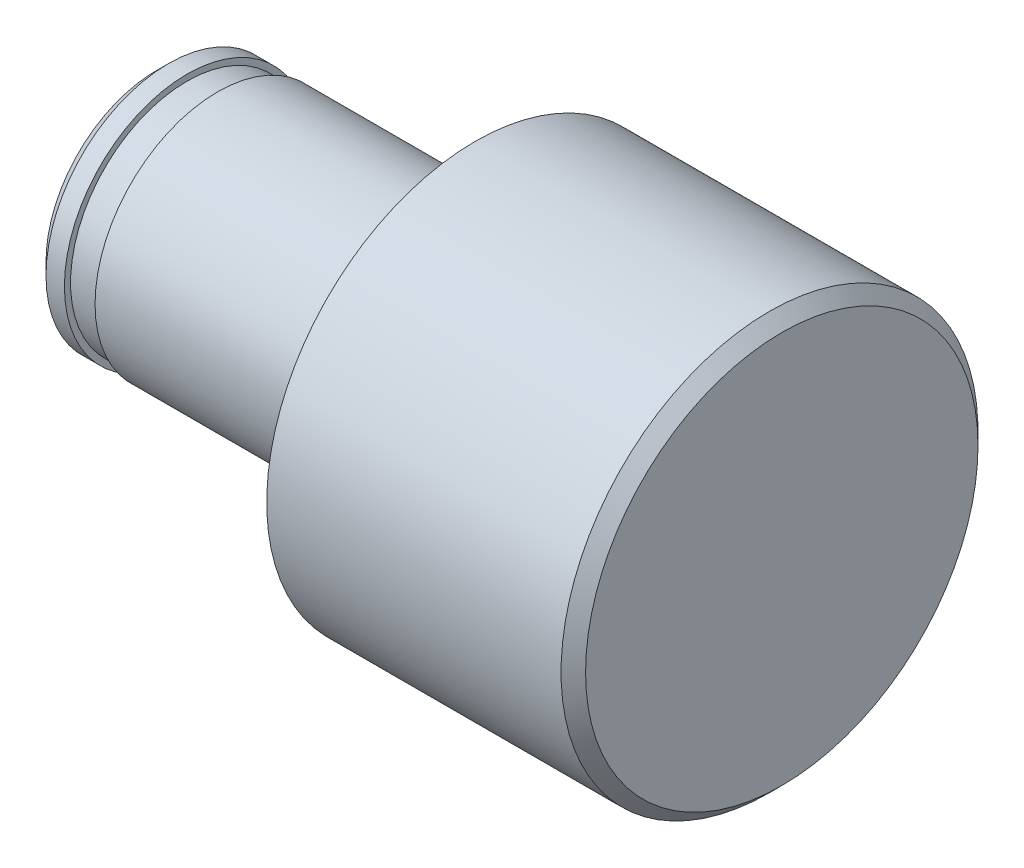
ISO-10303-21;
HEADER;
FILE_DESCRIPTION(('STEP AP214'),'2;1');
FILE_NAME('part.step','',(''),(''),'','','');
FILE_SCHEMA(('AUTOMOTIVE_DESIGN { 1 0 10303 214 1 1 1 1 }'));
ENDSEC;
DATA;
#1=APPLICATION_CONTEXT('core data for automotive mechanical design processes');
#2=APPLICATION_PROTOCOL_DEFINITION('international standard','automotive_design',2000,#1);
#3=PRODUCT_CONTEXT('',#1,'mechanical');
#4=PRODUCT('Part','Part','',(#3));
#5=PRODUCT_RELATED_PRODUCT_CATEGORY('part','',(#4));
#6=PRODUCT_DEFINITION_FORMATION('','',#4);
#7=PRODUCT_DEFINITION_CONTEXT('part definition',#1,'design');
#8=PRODUCT_DEFINITION('design','',#6,#7);
#9=PRODUCT_DEFINITION_SHAPE('','',#8);
#10=(LENGTH_UNIT() NAMED_UNIT(*) SI_UNIT(.MILLI.,.METRE.));
#11=(NAMED_UNIT(*) PLANE_ANGLE_UNIT() SI_UNIT($,.RADIAN.));
#12=(NAMED_UNIT(*) SI_UNIT($,.STERADIAN.) SOLID_ANGLE_UNIT());
#13=UNCERTAINTY_MEASURE_WITH_UNIT(LENGTH_MEASURE(1.E-05),#10,'distance_accuracy_value','');
#14=(GEOMETRIC_REPRESENTATION_CONTEXT(3) GLOBAL_UNCERTAINTY_ASSIGNED_CONTEXT((#13)) GLOBAL_UNIT_ASSIGNED_CONTEXT((#10,
#11,#12)) REPRESENTATION_CONTEXT('',''));
#15=CARTESIAN_POINT('',(0.,0.,0.));
#16=DIRECTION('',(0.,0.,1.));
#17=DIRECTION('',(1.,0.,0.));
#18=AXIS2_PLACEMENT_3D('',#15,#16,#17);
#19=CARTESIAN_POINT('',(3.95645161290323,3.4,0.));
#20=DIRECTION('',(1.,0.,0.));
#21=DIRECTION('',(0.,1.,0.));
#22=AXIS2_PLACEMENT_3D('',#19,#20,#21);
#23=PLANE('',#22);
#24=CARTESIAN_POINT('',(3.95645161290323,0.,0.));
#25=DIRECTION('',(1.,0.,0.));
#26=DIRECTION('',(0.,1.,0.));
#27=AXIS2_PLACEMENT_3D('',#24,#25,#26);
#28=CIRCLE('',#27,3.2);
#29=CARTESIAN_POINT('',(3.95645161290323,3.2,0.));
#30=VERTEX_POINT('',#29);
#31=EDGE_CURVE('E57',#30,#30,#28,.T.);
#32=ORIENTED_EDGE('',*,*,#31,.T.);
#33=EDGE_LOOP('',(#32));
#34=FACE_BOUND('',#33,.T.);
#35=ADVANCED_FACE('F41',(#34),#23,.T.);
#36=CARTESIAN_POINT('',(-6.24354838709677,0.,0.));
#37=DIRECTION('',(-1.,0.,0.));
#38=DIRECTION('',(0.,-1.,0.));
#39=AXIS2_PLACEMENT_3D('',#36,#37,#38);
#40=PLANE('',#39);
#41=CARTESIAN_POINT('',(-6.24354838709677,0.,0.));
#42=DIRECTION('',(-1.,0.,0.));
#43=DIRECTION('',(0.,-1.,0.));
#44=AXIS2_PLACEMENT_3D('',#41,#42,#43);
#45=CIRCLE('',#44,1.8);
#46=CARTESIAN_POINT('',(-6.24354838709677,-1.8,0.));
#47=VERTEX_POINT('',#46);
#48=EDGE_CURVE('E10',#47,#47,#45,.T.);
#49=ORIENTED_EDGE('',*,*,#48,.T.);
#50=EDGE_LOOP('',(#49));
#51=FACE_BOUND('',#50,.T.);
#52=ADVANCED_FACE('F99',(#51),#40,.T.);
#53=CARTESIAN_POINT('',(3.95645161290323,0.,0.));
#54=DIRECTION('',(1.,0.,0.));
#55=DIRECTION('',(0.,1.,0.));
#56=AXIS2_PLACEMENT_3D('',#53,#54,#55);
#57=CYLINDRICAL_SURFACE('',#56,2.);
#58=CARTESIAN_POINT('',(-6.04354838709677,0.,0.));
#59=DIRECTION('',(-1.,0.,0.));
#60=DIRECTION('',(0.,-1.,0.));
#61=AXIS2_PLACEMENT_3D('',#58,#59,#60);
#62=CIRCLE('',#61,2.);
#63=CARTESIAN_POINT('',(-6.04354838709677,-2.,0.));
#64=VERTEX_POINT('',#63);
#65=EDGE_CURVE('E49',#64,#64,#62,.F.);
#66=ORIENTED_EDGE('',*,*,#65,.T.);
#67=EDGE_LOOP('',(#66));
#68=FACE_BOUND('',#67,.T.);
#69=CARTESIAN_POINT('',(-5.74354838709677,0.,0.));
#70=DIRECTION('',(1.,0.,0.));
#71=DIRECTION('',(0.,1.,0.));
#72=AXIS2_PLACEMENT_3D('',#69,#70,#71);
#73=CIRCLE('',#72,2.);
#74=CARTESIAN_POINT('',(-5.74354838709677,2.,0.));
#75=VERTEX_POINT('',#74);
#76=EDGE_CURVE('E62',#75,#75,#73,.T.);
#77=ORIENTED_EDGE('',*,*,#76,.F.);
#78=EDGE_LOOP('',(#77));
#79=FACE_BOUND('',#78,.T.);
#80=ADVANCED_FACE('F105',(#68,#79),#57,.T.);
#81=CARTESIAN_POINT('',(-5.74354838709677,2.,0.));
#82=DIRECTION('',(1.,0.,0.));
#83=DIRECTION('',(0.,1.,0.));
#84=AXIS2_PLACEMENT_3D('',#81,#82,#83);
#85=PLANE('',#84);
#86=ORIENTED_EDGE('',*,*,#76,.T.);
#87=EDGE_LOOP('',(#86));
#88=FACE_BOUND('',#87,.T.);
#89=CARTESIAN_POINT('',(-5.74354838709677,0.,0.));
#90=DIRECTION('',(1.,0.,0.));
#91=DIRECTION('',(0.,1.,0.));
#92=AXIS2_PLACEMENT_3D('',#89,#90,#91);
#93=CIRCLE('',#92,1.9);
#94=CARTESIAN_POINT('',(-5.74354838709677,1.9,0.));
#95=VERTEX_POINT('',#94);
#96=EDGE_CURVE('E65',#95,#95,#93,.T.);
#97=ORIENTED_EDGE('',*,*,#96,.F.);
#98=EDGE_LOOP('',(#97));
#99=FACE_BOUND('',#98,.T.);
#100=ADVANCED_FACE('F164',(#88,#99),#85,.T.);
#101=CARTESIAN_POINT('',(3.95645161290323,0.,0.));
#102=DIRECTION('',(1.,0.,0.));
#103=DIRECTION('',(0.,1.,0.));
#104=AXIS2_PLACEMENT_3D('',#101,#102,#103);
#105=CYLINDRICAL_SURFACE('',#104,1.9);
#106=ORIENTED_EDGE('',*,*,#96,.T.);
#107=EDGE_LOOP('',(#106));
#108=FACE_BOUND('',#107,.T.);
#109=CARTESIAN_POINT('',(-5.24354838709677,0.,0.));
#110=DIRECTION('',(1.,0.,0.));
#111=DIRECTION('',(0.,1.,0.));
#112=AXIS2_PLACEMENT_3D('',#109,#110,#111);
#113=CIRCLE('',#112,1.9);
#114=CARTESIAN_POINT('',(-5.24354838709677,1.9,0.));
#115=VERTEX_POINT('',#114);
#116=EDGE_CURVE('E68',#115,#115,#113,.T.);
#117=ORIENTED_EDGE('',*,*,#116,.F.);
#118=EDGE_LOOP('',(#117));
#119=FACE_BOUND('',#118,.T.);
#120=ADVANCED_FACE('F154',(#108,#119),#105,.T.);
#121=CARTESIAN_POINT('',(-5.24354838709677,1.9,0.));
#122=DIRECTION('',(-1.,0.,0.));
#123=DIRECTION('',(0.,-1.,0.));
#124=AXIS2_PLACEMENT_3D('',#121,#122,#123);
#125=PLANE('',#124);
#126=ORIENTED_EDGE('',*,*,#116,.T.);
#127=EDGE_LOOP('',(#126));
#128=FACE_BOUND('',#127,.T.);
#129=CARTESIAN_POINT('',(-5.24354838709677,0.,0.));
#130=DIRECTION('',(1.,0.,0.));
#131=DIRECTION('',(0.,1.,0.));
#132=AXIS2_PLACEMENT_3D('',#129,#130,#131);
#133=CIRCLE('',#132,2.);
#134=CARTESIAN_POINT('',(-5.24354838709677,2.,0.));
#135=VERTEX_POINT('',#134);
#136=EDGE_CURVE('E71',#135,#135,#133,.T.);
#137=ORIENTED_EDGE('',*,*,#136,.F.);
#138=EDGE_LOOP('',(#137));
#139=FACE_BOUND('',#138,.T.);
#140=ADVANCED_FACE('F96',(#128,#139),#125,.T.);
#141=CARTESIAN_POINT('',(3.95645161290323,0.,0.));
#142=DIRECTION('',(1.,0.,0.));
#143=DIRECTION('',(0.,1.,0.));
#144=AXIS2_PLACEMENT_3D('',#141,#142,#143);
#145=CYLINDRICAL_SURFACE('',#144,2.);
#146=ORIENTED_EDGE('',*,*,#136,.T.);
#147=EDGE_LOOP('',(#146));
#148=FACE_BOUND('',#147,.T.);
#149=CARTESIAN_POINT('',(-1.04354838709677,0.,0.));
#150=DIRECTION('',(1.,0.,0.));
#151=DIRECTION('',(0.,1.,0.));
#152=AXIS2_PLACEMENT_3D('',#149,#150,#151);
#153=CIRCLE('',#152,2.);
#154=CARTESIAN_POINT('',(-1.04354838709677,2.,0.));
#155=VERTEX_POINT('',#154);
#156=EDGE_CURVE('E74',#155,#155,#153,.T.);
#157=ORIENTED_EDGE('',*,*,#156,.F.);
#158=EDGE_LOOP('',(#157));
#159=FACE_BOUND('',#158,.T.);
#160=ADVANCED_FACE('F85',(#148,#159),#145,.T.);
#161=CARTESIAN_POINT('',(-1.04354838709677,2.,0.));
#162=DIRECTION('',(-1.,0.,0.));
#163=DIRECTION('',(0.,-1.,0.));
#164=AXIS2_PLACEMENT_3D('',#161,#162,#163);
#165=PLANE('',#164);
#166=ORIENTED_EDGE('',*,*,#156,.T.);
#167=EDGE_LOOP('',(#166));
#168=FACE_BOUND('',#167,.T.);
#169=CARTESIAN_POINT('',(-1.04354838709677,0.,0.));
#170=DIRECTION('',(1.,0.,0.));
#171=DIRECTION('',(0.,1.,0.));
#172=AXIS2_PLACEMENT_3D('',#169,#170,#171);
#173=CIRCLE('',#172,3.4);
#174=CARTESIAN_POINT('',(-1.04354838709677,3.4,0.));
#175=VERTEX_POINT('',#174);
#176=EDGE_CURVE('E77',#175,#175,#173,.T.);
#177=ORIENTED_EDGE('',*,*,#176,.F.);
#178=EDGE_LOOP('',(#177));
#179=FACE_BOUND('',#178,.T.);
#180=ADVANCED_FACE('F83',(#168,#179),#165,.T.);
#181=CARTESIAN_POINT('',(3.95645161290323,0.,0.));
#182=DIRECTION('',(1.,0.,0.));
#183=DIRECTION('',(0.,1.,0.));
#184=AXIS2_PLACEMENT_3D('',#181,#182,#183);
#185=CYLINDRICAL_SURFACE('',#184,3.4);
#186=CARTESIAN_POINT('',(3.75645161290323,0.,0.));
#187=DIRECTION('',(1.,0.,0.));
#188=DIRECTION('',(0.,1.,0.));
#189=AXIS2_PLACEMENT_3D('',#186,#187,#188);
#190=CIRCLE('',#189,3.4);
#191=CARTESIAN_POINT('',(3.75645161290323,3.4,0.));
#192=VERTEX_POINT('',#191);
#193=EDGE_CURVE('E53',#192,#192,#190,.F.);
#194=ORIENTED_EDGE('',*,*,#193,.T.);
#195=EDGE_LOOP('',(#194));
#196=FACE_BOUND('',#195,.T.);
#197=ORIENTED_EDGE('',*,*,#176,.T.);
#198=EDGE_LOOP('',(#197));
#199=FACE_BOUND('',#198,.T.);
#200=ADVANCED_FACE('F81',(#196,#199),#185,.T.);
#201=CARTESIAN_POINT('',(3.95645161290323,0.,0.));
#202=DIRECTION('',(-1.,0.,0.));
#203=DIRECTION('',(0.,-1.,0.));
#204=AXIS2_PLACEMENT_3D('',#201,#202,#203);
#205=CONICAL_SURFACE('',#204,3.2,0.785398163397446);
#206=ORIENTED_EDGE('',*,*,#193,.F.);
#207=EDGE_LOOP('',(#206));
#208=FACE_BOUND('',#207,.T.);
#209=ORIENTED_EDGE('',*,*,#31,.F.);
#210=EDGE_LOOP('',(#209));
#211=FACE_BOUND('',#210,.T.);
#212=ADVANCED_FACE('F93',(#208,#211),#205,.T.);
#213=CARTESIAN_POINT('',(-6.04354838709677,0.,0.));
#214=DIRECTION('',(1.,0.,0.));
#215=DIRECTION('',(0.,1.,0.));
#216=AXIS2_PLACEMENT_3D('',#213,#214,#215);
#217=CONICAL_SURFACE('',#216,2.,0.785398163397448);
#218=ORIENTED_EDGE('',*,*,#48,.F.);
#219=EDGE_LOOP('',(#218));
#220=FACE_BOUND('',#219,.T.);
#221=ORIENTED_EDGE('',*,*,#65,.F.);
#222=EDGE_LOOP('',(#221));
#223=FACE_BOUND('',#222,.T.);
#224=ADVANCED_FACE('F44',(#220,#223),#217,.T.);
#225=CLOSED_SHELL('',(#35,#52,#80,#100,#120,#140,#160,#180,#200,#212,#224));
#226=MANIFOLD_SOLID_BREP('B2',#225);
#227=ADVANCED_BREP_SHAPE_REPRESENTATION('',(#18,#226),#14);
#228=SHAPE_DEFINITION_REPRESENTATION(#9,#227);
ENDSEC;
END-ISO-10303-21;
